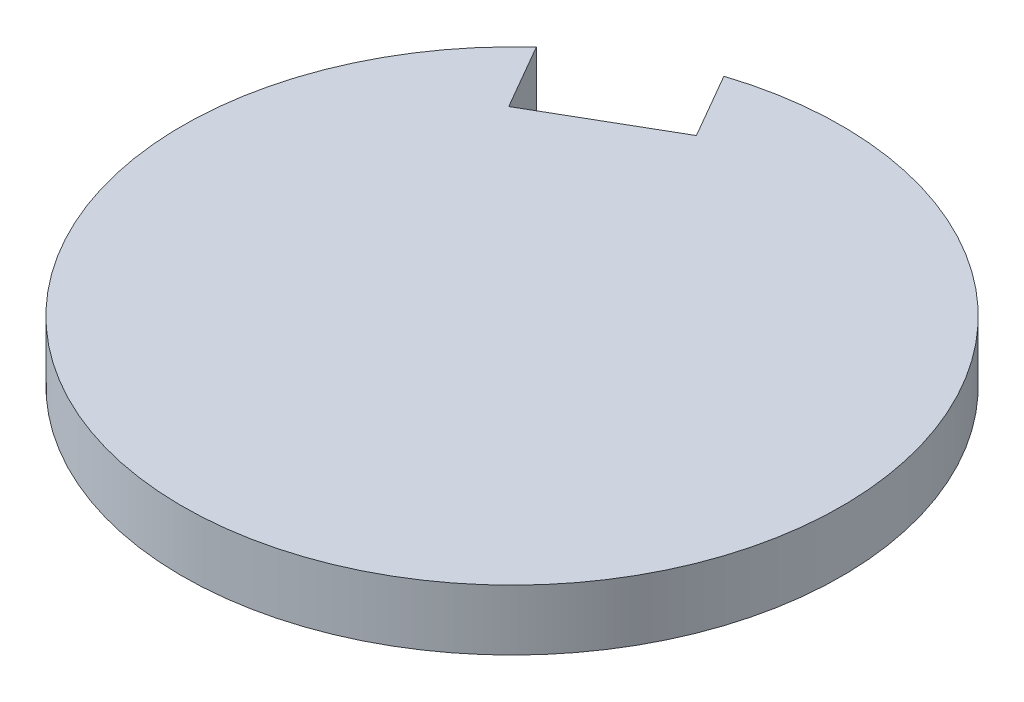
ISO-10303-21;
HEADER;
FILE_DESCRIPTION(('STEP AP214'),'2;1');
FILE_NAME('part.step','',(''),(''),'','','');
FILE_SCHEMA(('AUTOMOTIVE_DESIGN { 1 0 10303 214 1 1 1 1 }'));
ENDSEC;
DATA;
#1=APPLICATION_CONTEXT('core data for automotive mechanical design processes');
#2=APPLICATION_PROTOCOL_DEFINITION('international standard','automotive_design',2000,#1);
#3=PRODUCT_CONTEXT('',#1,'mechanical');
#4=PRODUCT('Part','Part','',(#3));
#5=PRODUCT_RELATED_PRODUCT_CATEGORY('part','',(#4));
#6=PRODUCT_DEFINITION_FORMATION('','',#4);
#7=PRODUCT_DEFINITION_CONTEXT('part definition',#1,'design');
#8=PRODUCT_DEFINITION('design','',#6,#7);
#9=PRODUCT_DEFINITION_SHAPE('','',#8);
#10=(LENGTH_UNIT() NAMED_UNIT(*) SI_UNIT(.MILLI.,.METRE.));
#11=(NAMED_UNIT(*) PLANE_ANGLE_UNIT() SI_UNIT($,.RADIAN.));
#12=(NAMED_UNIT(*) SI_UNIT($,.STERADIAN.) SOLID_ANGLE_UNIT());
#13=UNCERTAINTY_MEASURE_WITH_UNIT(LENGTH_MEASURE(1.E-05),#10,'distance_accuracy_value','');
#14=(GEOMETRIC_REPRESENTATION_CONTEXT(3) GLOBAL_UNCERTAINTY_ASSIGNED_CONTEXT((#13)) GLOBAL_UNIT_ASSIGNED_CONTEXT((#10,
#11,#12)) REPRESENTATION_CONTEXT('',''));
#15=CARTESIAN_POINT('',(0.,0.,0.));
#16=DIRECTION('',(0.,0.,1.));
#17=DIRECTION('',(1.,0.,0.));
#18=AXIS2_PLACEMENT_3D('',#15,#16,#17);
#19=CARTESIAN_POINT('',(0.,-13.9999974,0.));
#20=DIRECTION('',(0.,1.,0.));
#21=DIRECTION('',(0.,0.,1.));
#22=AXIS2_PLACEMENT_3D('',#19,#20,#21);
#23=CYLINDRICAL_SURFACE('',#22,152.4);
#24=DIRECTION('',(0.,1.,0.));
#25=VECTOR('',#24,1.);
#26=CARTESIAN_POINT('',(-102.024317243996,-13.9999974,-113.211301074126));
#27=LINE('',#26,#25);
#28=CARTESIAN_POINT('',(-102.024317243996,-13.9999974,-113.211301074126));
#29=VERTEX_POINT('',#28);
#30=CARTESIAN_POINT('',(-102.024317243996,13.9999974,-113.211301074126));
#31=VERTEX_POINT('',#30);
#32=EDGE_CURVE('E54',#29,#31,#27,.T.);
#33=ORIENTED_EDGE('',*,*,#32,.F.);
#34=CARTESIAN_POINT('',(0.,-13.9999974,0.));
#35=DIRECTION('',(0.,1.,0.));
#36=DIRECTION('',(0.,0.,1.));
#37=AXIS2_PLACEMENT_3D('',#34,#35,#36);
#38=CIRCLE('',#37,152.4);
#39=CARTESIAN_POINT('',(-47.031704103684,-13.9999974,-144.961301074126));
#40=VERTEX_POINT('',#39);
#41=EDGE_CURVE('E88',#29,#40,#38,.T.);
#42=ORIENTED_EDGE('',*,*,#41,.T.);
#43=DIRECTION('',(0.,1.,0.));
#44=VECTOR('',#43,1.);
#45=CARTESIAN_POINT('',(-47.031704103684,-13.9999974,-144.961301074126));
#46=LINE('',#45,#44);
#47=CARTESIAN_POINT('',(-47.031704103684,13.9999974,-144.961301074126));
#48=VERTEX_POINT('',#47);
#49=EDGE_CURVE('E95',#48,#40,#46,.F.);
#50=ORIENTED_EDGE('',*,*,#49,.F.);
#51=CARTESIAN_POINT('',(0.,13.9999974,0.));
#52=DIRECTION('',(0.,1.,0.));
#53=DIRECTION('',(0.,0.,1.));
#54=AXIS2_PLACEMENT_3D('',#51,#52,#53);
#55=CIRCLE('',#54,152.4);
#56=EDGE_CURVE('E99',#31,#48,#55,.T.);
#57=ORIENTED_EDGE('',*,*,#56,.F.);
#58=EDGE_LOOP('',(#33,#42,#50,#57));
#59=FACE_BOUND('',#58,.T.);
#60=ADVANCED_FACE('F33',(#59),#23,.T.);
#61=CARTESIAN_POINT('',(0.,-13.9999974,0.));
#62=DIRECTION('',(0.,1.,0.));
#63=DIRECTION('',(0.,0.,1.));
#64=AXIS2_PLACEMENT_3D('',#61,#62,#63);
#65=PLANE('',#64);
#66=ORIENTED_EDGE('',*,*,#41,.F.);
#67=DIRECTION('',(0.500000000000002,0.,0.866025403784437));
#68=VECTOR('',#67,1.);
#69=CARTESIAN_POINT('',(-103.696306570156,-13.9999974,-116.107271536748));
#70=LINE('',#69,#68);
#71=CARTESIAN_POINT('',(-84.6463065701559,-13.9999974,-83.1117036525614));
#72=VERTEX_POINT('',#71);
#73=EDGE_CURVE('E72',#29,#72,#70,.T.);
#74=ORIENTED_EDGE('',*,*,#73,.T.);
#75=DIRECTION('',(0.866025403784438,0.,-0.5));
#76=VECTOR('',#75,1.);
#77=CARTESIAN_POINT('',(-84.6463065701559,-13.9999974,-83.1117036525614));
#78=LINE('',#77,#76);
#79=CARTESIAN_POINT('',(-29.6536934298441,-13.9999974,-114.861703652561));
#80=VERTEX_POINT('',#79);
#81=EDGE_CURVE('E78',#72,#80,#78,.T.);
#82=ORIENTED_EDGE('',*,*,#81,.T.);
#83=DIRECTION('',(-0.499999999999999,0.,-0.866025403784439));
#84=VECTOR('',#83,1.);
#85=CARTESIAN_POINT('',(-29.6536934298441,-13.9999974,-114.861703652561));
#86=LINE('',#85,#84);
#87=EDGE_CURVE('E75',#80,#40,#86,.T.);
#88=ORIENTED_EDGE('',*,*,#87,.T.);
#89=EDGE_LOOP('',(#66,#74,#82,#88));
#90=FACE_BOUND('',#89,.T.);
#91=ADVANCED_FACE('F86',(#90),#65,.F.);
#92=CARTESIAN_POINT('',(0.,13.9999974,0.));
#93=DIRECTION('',(0.,1.,0.));
#94=DIRECTION('',(0.,0.,1.));
#95=AXIS2_PLACEMENT_3D('',#92,#93,#94);
#96=PLANE('',#95);
#97=DIRECTION('',(0.500000000000002,0.,0.866025403784437));
#98=VECTOR('',#97,1.);
#99=CARTESIAN_POINT('',(-27.4963065701556,13.9999974,15.8749999999999));
#100=LINE('',#99,#98);
#101=CARTESIAN_POINT('',(-84.6463065701559,13.9999974,-83.1117036525614));
#102=VERTEX_POINT('',#101);
#103=EDGE_CURVE('E11',#31,#102,#100,.T.);
#104=ORIENTED_EDGE('',*,*,#103,.F.);
#105=ORIENTED_EDGE('',*,*,#56,.T.);
#106=DIRECTION('',(-0.499999999999999,0.,-0.866025403784439));
#107=VECTOR('',#106,1.);
#108=CARTESIAN_POINT('',(27.4963065701559,13.9999974,-15.8749999999999));
#109=LINE('',#108,#107);
#110=CARTESIAN_POINT('',(-29.6536934298441,13.9999974,-114.861703652561));
#111=VERTEX_POINT('',#110);
#112=EDGE_CURVE('E41',#111,#48,#109,.T.);
#113=ORIENTED_EDGE('',*,*,#112,.F.);
#114=DIRECTION('',(0.866025403784439,0.,-0.5));
#115=VECTOR('',#114,1.);
#116=CARTESIAN_POINT('',(-57.15,13.9999974,-98.9867036525613));
#117=LINE('',#116,#115);
#118=EDGE_CURVE('E103',#102,#111,#117,.T.);
#119=ORIENTED_EDGE('',*,*,#118,.F.);
#120=EDGE_LOOP('',(#104,#105,#113,#119));
#121=FACE_BOUND('',#120,.T.);
#122=ADVANCED_FACE('F112',(#121),#96,.T.);
#123=CARTESIAN_POINT('',(-103.696306570156,-13.9999974,-116.107271536748));
#124=DIRECTION('',(-0.866025403784437,0.,0.500000000000002));
#125=DIRECTION('',(0.500000000000002,0.,0.866025403784437));
#126=AXIS2_PLACEMENT_3D('',#123,#124,#125);
#127=PLANE('',#126);
#128=ORIENTED_EDGE('',*,*,#32,.T.);
#129=ORIENTED_EDGE('',*,*,#103,.T.);
#130=DIRECTION('',(0.,1.,0.));
#131=VECTOR('',#130,1.);
#132=CARTESIAN_POINT('',(-84.6463065701559,-13.9999974,-83.1117036525614));
#133=LINE('',#132,#131);
#134=EDGE_CURVE('E48',#72,#102,#133,.T.);
#135=ORIENTED_EDGE('',*,*,#134,.F.);
#136=ORIENTED_EDGE('',*,*,#73,.F.);
#137=EDGE_LOOP('',(#128,#129,#135,#136));
#138=FACE_BOUND('',#137,.T.);
#139=ADVANCED_FACE('F70',(#138),#127,.F.);
#140=CARTESIAN_POINT('',(-29.6536934298441,-13.9999974,-114.861703652561));
#141=DIRECTION('',(0.866025403784439,0.,-0.499999999999999));
#142=DIRECTION('',(-0.499999999999999,0.,-0.866025403784439));
#143=AXIS2_PLACEMENT_3D('',#140,#141,#142);
#144=PLANE('',#143);
#145=CARTESIAN_POINT('',(-39.612698766764,0.,-132.111206888956));
#146=DIRECTION('',(0.866025403784439,0.,-0.499999999999999));
#147=DIRECTION('',(-0.499999999999999,0.,-0.866025403784439));
#148=AXIS2_PLACEMENT_3D('',#145,#146,#147);
#149=CIRCLE('',#148,8.89000000000002);
#150=CARTESIAN_POINT('',(-44.057698766764,0.,-139.8101727286));
#151=VERTEX_POINT('',#150);
#152=EDGE_CURVE('E36',#151,#151,#149,.F.);
#153=ORIENTED_EDGE('',*,*,#152,.F.);
#154=EDGE_LOOP('',(#153));
#155=FACE_BOUND('',#154,.T.);
#156=ORIENTED_EDGE('',*,*,#49,.T.);
#157=ORIENTED_EDGE('',*,*,#87,.F.);
#158=DIRECTION('',(0.,1.,0.));
#159=VECTOR('',#158,1.);
#160=CARTESIAN_POINT('',(-29.6536934298441,-13.9999974,-114.861703652561));
#161=LINE('',#160,#159);
#162=EDGE_CURVE('E74',#80,#111,#161,.T.);
#163=ORIENTED_EDGE('',*,*,#162,.T.);
#164=ORIENTED_EDGE('',*,*,#112,.T.);
#165=EDGE_LOOP('',(#156,#157,#163,#164));
#166=FACE_BOUND('',#165,.T.);
#167=ADVANCED_FACE('F108',(#155,#166),#144,.F.);
#168=CARTESIAN_POINT('',(-84.6463065701559,-13.9999974,-83.1117036525614));
#169=DIRECTION('',(0.5,0.,0.866025403784438));
#170=DIRECTION('',(0.866025403784439,0.,-0.5));
#171=AXIS2_PLACEMENT_3D('',#168,#169,#170);
#172=PLANE('',#171);
#173=ORIENTED_EDGE('',*,*,#118,.T.);
#174=ORIENTED_EDGE('',*,*,#162,.F.);
#175=ORIENTED_EDGE('',*,*,#81,.F.);
#176=ORIENTED_EDGE('',*,*,#134,.T.);
#177=EDGE_LOOP('',(#173,#174,#175,#176));
#178=FACE_BOUND('',#177,.T.);
#179=ADVANCED_FACE('F79',(#178),#172,.F.);
#180=CARTESIAN_POINT('',(-30.8138806643144,0.,-137.191206888956));
#181=DIRECTION('',(-0.866025403784438,0.,0.500000000000002));
#182=DIRECTION('',(0.500000000000002,0.,0.866025403784438));
#183=AXIS2_PLACEMENT_3D('',#180,#181,#182);
#184=CYLINDRICAL_SURFACE('',#183,8.89000000000002);
#185=CARTESIAN_POINT('',(-30.8138806643144,0.,-137.191206888956));
#186=DIRECTION('',(0.866025403784437,0.,-0.500000000000002));
#187=DIRECTION('',(-0.500000000000002,0.,-0.866025403784437));
#188=AXIS2_PLACEMENT_3D('',#185,#186,#187);
#189=CIRCLE('',#188,8.89000000000002);
#190=CARTESIAN_POINT('',(-35.2588806643144,0.,-144.8901727286));
#191=VERTEX_POINT('',#190);
#192=EDGE_CURVE('E91',#191,#191,#189,.T.);
#193=ORIENTED_EDGE('',*,*,#192,.T.);
#194=EDGE_LOOP('',(#193));
#195=FACE_BOUND('',#194,.T.);
#196=ORIENTED_EDGE('',*,*,#152,.T.);
#197=EDGE_LOOP('',(#196));
#198=FACE_BOUND('',#197,.T.);
#199=ADVANCED_FACE('F148',(#195,#198),#184,.F.);
#200=CARTESIAN_POINT('',(-30.8138806643144,0.,-137.191206888956));
#201=DIRECTION('',(0.866025403784437,0.,-0.500000000000002));
#202=DIRECTION('',(-0.500000000000002,0.,-0.866025403784437));
#203=AXIS2_PLACEMENT_3D('',#200,#201,#202);
#204=PLANE('',#203);
#205=ORIENTED_EDGE('',*,*,#192,.F.);
#206=EDGE_LOOP('',(#205));
#207=FACE_BOUND('',#206,.T.);
#208=ADVANCED_FACE('F164',(#207),#204,.F.);
#209=CLOSED_SHELL('',(#60,#91,#122,#139,#167,#179,#199,#208));
#210=MANIFOLD_SOLID_BREP('B2',#209);
#211=ADVANCED_BREP_SHAPE_REPRESENTATION('',(#18,#210),#14);
#212=SHAPE_DEFINITION_REPRESENTATION(#9,#211);
ENDSEC;
END-ISO-10303-21;
